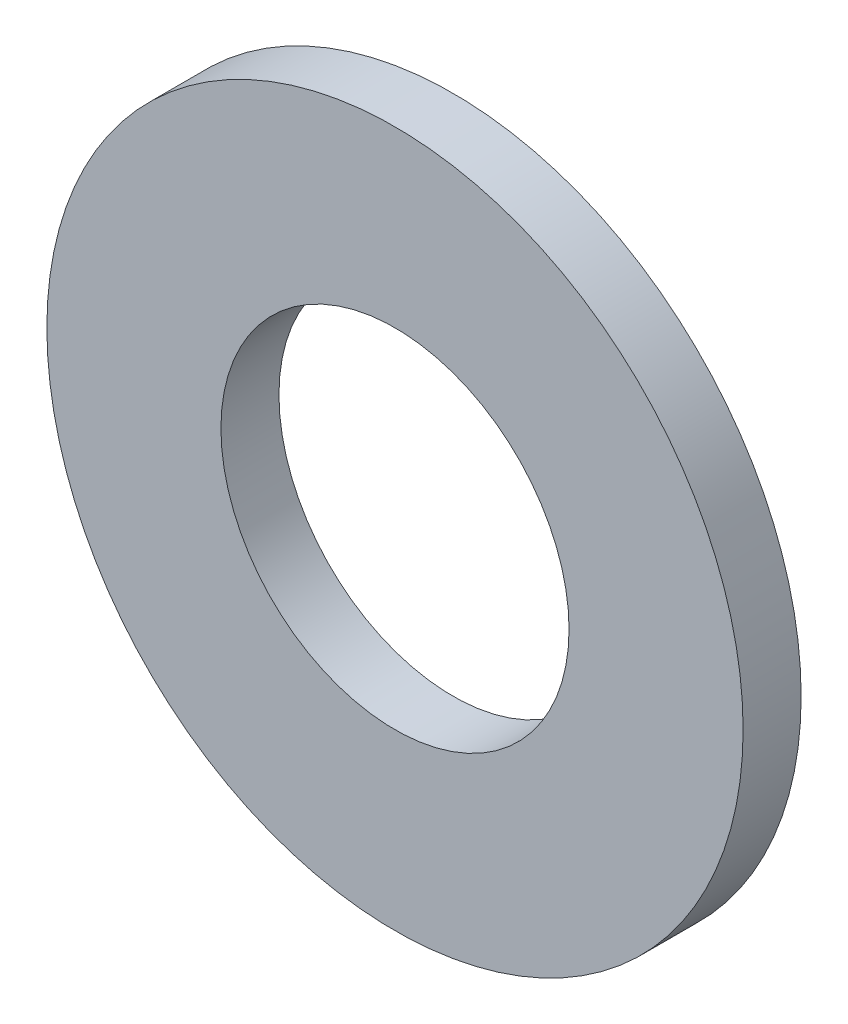
ISO-10303-21;
HEADER;
FILE_DESCRIPTION(('STEP AP214'),'2;1');
FILE_NAME('part.step','',(''),(''),'','','');
FILE_SCHEMA(('AUTOMOTIVE_DESIGN { 1 0 10303 214 1 1 1 1 }'));
ENDSEC;
DATA;
#1=APPLICATION_CONTEXT('core data for automotive mechanical design processes');
#2=APPLICATION_PROTOCOL_DEFINITION('international standard','automotive_design',2000,#1);
#3=PRODUCT_CONTEXT('',#1,'mechanical');
#4=PRODUCT('Part','Part','',(#3));
#5=PRODUCT_RELATED_PRODUCT_CATEGORY('part','',(#4));
#6=PRODUCT_DEFINITION_FORMATION('','',#4);
#7=PRODUCT_DEFINITION_CONTEXT('part definition',#1,'design');
#8=PRODUCT_DEFINITION('design','',#6,#7);
#9=PRODUCT_DEFINITION_SHAPE('','',#8);
#10=(LENGTH_UNIT() NAMED_UNIT(*) SI_UNIT(.MILLI.,.METRE.));
#11=(NAMED_UNIT(*) PLANE_ANGLE_UNIT() SI_UNIT($,.RADIAN.));
#12=(NAMED_UNIT(*) SI_UNIT($,.STERADIAN.) SOLID_ANGLE_UNIT());
#13=UNCERTAINTY_MEASURE_WITH_UNIT(LENGTH_MEASURE(1.E-05),#10,'distance_accuracy_value','');
#14=(GEOMETRIC_REPRESENTATION_CONTEXT(3) GLOBAL_UNCERTAINTY_ASSIGNED_CONTEXT((#13)) GLOBAL_UNIT_ASSIGNED_CONTEXT((#10,
#11,#12)) REPRESENTATION_CONTEXT('',''));
#15=CARTESIAN_POINT('',(0.,0.,0.));
#16=DIRECTION('',(0.,0.,1.));
#17=DIRECTION('',(1.,0.,0.));
#18=AXIS2_PLACEMENT_3D('',#15,#16,#17);
#19=CARTESIAN_POINT('',(0.,0.,0.79375));
#20=DIRECTION('',(0.,0.,1.));
#21=DIRECTION('',(1.,0.,0.));
#22=AXIS2_PLACEMENT_3D('',#19,#20,#21);
#23=PLANE('',#22);
#24=CARTESIAN_POINT('',(0.,0.,0.79375));
#25=DIRECTION('',(0.,0.,1.));
#26=DIRECTION('',(1.,0.,0.));
#27=AXIS2_PLACEMENT_3D('',#24,#25,#26);
#28=CIRCLE('',#27,9.525);
#29=CARTESIAN_POINT('',(9.525,0.,0.79375));
#30=VERTEX_POINT('',#29);
#31=EDGE_CURVE('E10',#30,#30,#28,.T.);
#32=ORIENTED_EDGE('',*,*,#31,.T.);
#33=EDGE_LOOP('',(#32));
#34=FACE_BOUND('',#33,.T.);
#35=CARTESIAN_POINT('',(0.,0.,0.79375));
#36=DIRECTION('',(0.,0.,1.));
#37=DIRECTION('',(1.,0.,0.));
#38=AXIS2_PLACEMENT_3D('',#35,#36,#37);
#39=CIRCLE('',#38,4.7625);
#40=CARTESIAN_POINT('',(4.7625,0.,0.79375));
#41=VERTEX_POINT('',#40);
#42=EDGE_CURVE('E41',#41,#41,#39,.T.);
#43=ORIENTED_EDGE('',*,*,#42,.F.);
#44=EDGE_LOOP('',(#43));
#45=FACE_BOUND('',#44,.T.);
#46=ADVANCED_FACE('F30',(#34,#45),#23,.T.);
#47=CARTESIAN_POINT('',(0.,0.,-0.79375));
#48=DIRECTION('',(0.,0.,1.));
#49=DIRECTION('',(1.,0.,0.));
#50=AXIS2_PLACEMENT_3D('',#47,#48,#49);
#51=PLANE('',#50);
#52=CARTESIAN_POINT('',(0.,0.,-0.79375));
#53=DIRECTION('',(0.,0.,1.));
#54=DIRECTION('',(1.,0.,0.));
#55=AXIS2_PLACEMENT_3D('',#52,#53,#54);
#56=CIRCLE('',#55,9.525);
#57=CARTESIAN_POINT('',(9.525,0.,-0.79375));
#58=VERTEX_POINT('',#57);
#59=EDGE_CURVE('E34',#58,#58,#56,.T.);
#60=ORIENTED_EDGE('',*,*,#59,.F.);
#61=EDGE_LOOP('',(#60));
#62=FACE_BOUND('',#61,.T.);
#63=CARTESIAN_POINT('',(0.,0.,-0.79375));
#64=DIRECTION('',(0.,0.,1.));
#65=DIRECTION('',(1.,0.,0.));
#66=AXIS2_PLACEMENT_3D('',#63,#64,#65);
#67=CIRCLE('',#66,4.7625);
#68=CARTESIAN_POINT('',(4.7625,0.,-0.79375));
#69=VERTEX_POINT('',#68);
#70=EDGE_CURVE('E43',#69,#69,#67,.T.);
#71=ORIENTED_EDGE('',*,*,#70,.T.);
#72=EDGE_LOOP('',(#71));
#73=FACE_BOUND('',#72,.T.);
#74=ADVANCED_FACE('F53',(#62,#73),#51,.F.);
#75=CARTESIAN_POINT('',(0.,0.,0.79375));
#76=DIRECTION('',(0.,0.,-1.));
#77=DIRECTION('',(-1.,0.,0.));
#78=AXIS2_PLACEMENT_3D('',#75,#76,#77);
#79=CYLINDRICAL_SURFACE('',#78,9.525);
#80=ORIENTED_EDGE('',*,*,#31,.F.);
#81=EDGE_LOOP('',(#80));
#82=FACE_BOUND('',#81,.T.);
#83=ORIENTED_EDGE('',*,*,#59,.T.);
#84=EDGE_LOOP('',(#83));
#85=FACE_BOUND('',#84,.T.);
#86=ADVANCED_FACE('F32',(#82,#85),#79,.T.);
#87=CARTESIAN_POINT('',(0.,0.,0.79375));
#88=DIRECTION('',(0.,0.,-1.));
#89=DIRECTION('',(-1.,0.,0.));
#90=AXIS2_PLACEMENT_3D('',#87,#88,#89);
#91=CYLINDRICAL_SURFACE('',#90,4.7625);
#92=ORIENTED_EDGE('',*,*,#42,.T.);
#93=EDGE_LOOP('',(#92));
#94=FACE_BOUND('',#93,.T.);
#95=ORIENTED_EDGE('',*,*,#70,.F.);
#96=EDGE_LOOP('',(#95));
#97=FACE_BOUND('',#96,.T.);
#98=ADVANCED_FACE('F49',(#94,#97),#91,.F.);
#99=CLOSED_SHELL('',(#46,#74,#86,#98));
#100=MANIFOLD_SOLID_BREP('B2',#99);
#101=ADVANCED_BREP_SHAPE_REPRESENTATION('',(#18,#100),#14);
#102=SHAPE_DEFINITION_REPRESENTATION(#9,#101);
ENDSEC;
END-ISO-10303-21;
